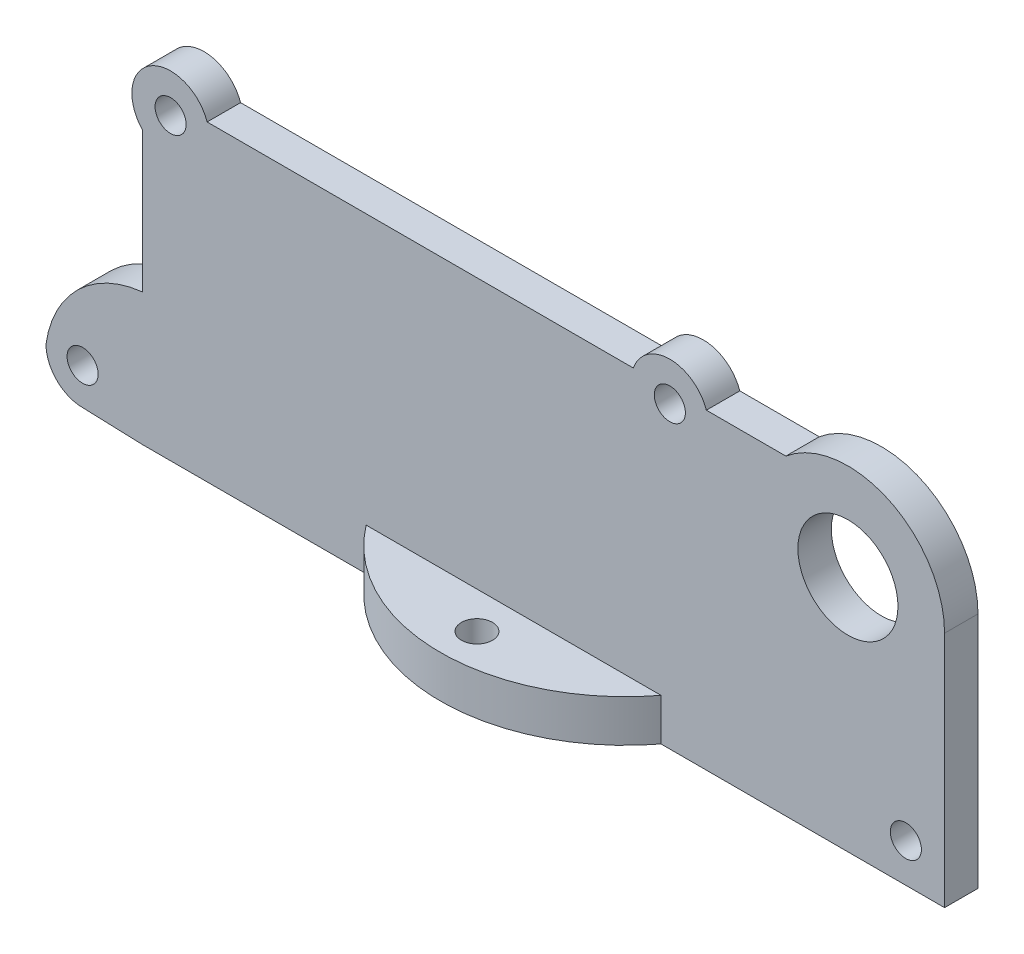
ISO-10303-21;
HEADER;
FILE_DESCRIPTION(('STEP AP214'),'2;1');
FILE_NAME('part.step','',(''),(''),'','','');
FILE_SCHEMA(('AUTOMOTIVE_DESIGN { 1 0 10303 214 1 1 1 1 }'));
ENDSEC;
DATA;
#1=APPLICATION_CONTEXT('core data for automotive mechanical design processes');
#2=APPLICATION_PROTOCOL_DEFINITION('international standard','automotive_design',2000,#1);
#3=PRODUCT_CONTEXT('',#1,'mechanical');
#4=PRODUCT('Part','Part','',(#3));
#5=PRODUCT_RELATED_PRODUCT_CATEGORY('part','',(#4));
#6=PRODUCT_DEFINITION_FORMATION('','',#4);
#7=PRODUCT_DEFINITION_CONTEXT('part definition',#1,'design');
#8=PRODUCT_DEFINITION('design','',#6,#7);
#9=PRODUCT_DEFINITION_SHAPE('','',#8);
#10=(LENGTH_UNIT() NAMED_UNIT(*) SI_UNIT(.MILLI.,.METRE.));
#11=(NAMED_UNIT(*) PLANE_ANGLE_UNIT() SI_UNIT($,.RADIAN.));
#12=(NAMED_UNIT(*) SI_UNIT($,.STERADIAN.) SOLID_ANGLE_UNIT());
#13=UNCERTAINTY_MEASURE_WITH_UNIT(LENGTH_MEASURE(1.E-05),#10,'distance_accuracy_value','');
#14=(GEOMETRIC_REPRESENTATION_CONTEXT(3) GLOBAL_UNCERTAINTY_ASSIGNED_CONTEXT((#13)) GLOBAL_UNIT_ASSIGNED_CONTEXT((#10,
#11,#12)) REPRESENTATION_CONTEXT('',''));
#15=CARTESIAN_POINT('',(0.,0.,0.));
#16=DIRECTION('',(0.,0.,1.));
#17=DIRECTION('',(1.,0.,0.));
#18=AXIS2_PLACEMENT_3D('',#15,#16,#17);
#19=CARTESIAN_POINT('',(0.,14.8,3.175));
#20=DIRECTION('',(0.,1.,0.));
#21=DIRECTION('',(0.,0.,1.));
#22=AXIS2_PLACEMENT_3D('',#19,#20,#21);
#23=PLANE('',#22);
#24=DIRECTION('',(0.,0.,-1.));
#25=VECTOR('',#24,1.);
#26=CARTESIAN_POINT('',(27.1358442652225,14.8,13.5694696834423));
#27=LINE('',#26,#25);
#28=CARTESIAN_POINT('',(27.1358442652225,14.8,3.175));
#29=VERTEX_POINT('',#28);
#30=CARTESIAN_POINT('',(27.1358442652225,14.8,0.));
#31=VERTEX_POINT('',#30);
#32=EDGE_CURVE('E305',#29,#31,#27,.T.);
#33=ORIENTED_EDGE('',*,*,#32,.F.);
#34=DIRECTION('',(1.,0.,0.));
#35=VECTOR('',#34,1.);
#36=CARTESIAN_POINT('',(0.,14.8,3.175));
#37=LINE('',#36,#35);
#38=CARTESIAN_POINT('',(34.6802621326928,14.8,3.175));
#39=VERTEX_POINT('',#38);
#40=EDGE_CURVE('E210',#29,#39,#37,.T.);
#41=ORIENTED_EDGE('',*,*,#40,.T.);
#42=DIRECTION('',(0.,0.,-1.));
#43=VECTOR('',#42,1.);
#44=CARTESIAN_POINT('',(34.6802621326928,14.8,15.1599874843489));
#45=LINE('',#44,#43);
#46=CARTESIAN_POINT('',(34.6802621326928,14.8,0.));
#47=VERTEX_POINT('',#46);
#48=EDGE_CURVE('E360',#39,#47,#45,.T.);
#49=ORIENTED_EDGE('',*,*,#48,.T.);
#50=DIRECTION('',(1.,0.,0.));
#51=VECTOR('',#50,1.);
#52=CARTESIAN_POINT('',(0.,14.8,0.));
#53=LINE('',#52,#51);
#54=EDGE_CURVE('E100',#31,#47,#53,.T.);
#55=ORIENTED_EDGE('',*,*,#54,.F.);
#56=EDGE_LOOP('',(#33,#41,#49,#55));
#57=FACE_BOUND('',#56,.T.);
#58=ADVANCED_FACE('F84',(#57),#23,.T.);
#59=CARTESIAN_POINT('',(-26.416,0.,3.175));
#60=DIRECTION('',(-1.,0.,0.));
#61=DIRECTION('',(0.,0.,1.));
#62=AXIS2_PLACEMENT_3D('',#59,#60,#61);
#63=PLANE('',#62);
#64=DIRECTION('',(0.,1.,0.));
#65=VECTOR('',#64,1.);
#66=CARTESIAN_POINT('',(-26.416,0.,3.175));
#67=LINE('',#66,#65);
#68=CARTESIAN_POINT('',(-26.416,-2.24921211834756,3.175));
#69=VERTEX_POINT('',#68);
#70=CARTESIAN_POINT('',(-26.416,11.0753976457499,3.175));
#71=VERTEX_POINT('',#70);
#72=EDGE_CURVE('E225',#69,#71,#67,.T.);
#73=ORIENTED_EDGE('',*,*,#72,.T.);
#74=DIRECTION('',(0.,0.,-1.));
#75=VECTOR('',#74,1.);
#76=CARTESIAN_POINT('',(-26.416,11.0753976457499,13.5694696834423));
#77=LINE('',#76,#75);
#78=CARTESIAN_POINT('',(-26.416,11.0753976457499,0.));
#79=VERTEX_POINT('',#78);
#80=EDGE_CURVE('E331',#79,#71,#77,.F.);
#81=ORIENTED_EDGE('',*,*,#80,.F.);
#82=DIRECTION('',(0.,1.,0.));
#83=VECTOR('',#82,1.);
#84=CARTESIAN_POINT('',(-26.416,0.,0.));
#85=LINE('',#84,#83);
#86=CARTESIAN_POINT('',(-26.416,-2.24921211834756,0.));
#87=VERTEX_POINT('',#86);
#88=EDGE_CURVE('E219',#87,#79,#85,.T.);
#89=ORIENTED_EDGE('',*,*,#88,.F.);
#90=DIRECTION('',(0.,0.,-1.));
#91=VECTOR('',#90,1.);
#92=CARTESIAN_POINT('',(-26.416,-2.24921211834756,13.5694696834423));
#93=LINE('',#92,#91);
#94=EDGE_CURVE('E93',#69,#87,#93,.T.);
#95=ORIENTED_EDGE('',*,*,#94,.F.);
#96=EDGE_LOOP('',(#73,#81,#89,#95));
#97=FACE_BOUND('',#96,.T.);
#98=ADVANCED_FACE('F397',(#97),#63,.T.);
#99=DIRECTION('',(0.,0.,-1.));
#100=VECTOR('',#99,1.);
#101=CARTESIAN_POINT('',(20.1956641522859,14.8,13.5694696834423));
#102=LINE('',#101,#100);
#103=CARTESIAN_POINT('',(20.1956641522859,14.8,0.));
#104=VERTEX_POINT('',#103);
#105=CARTESIAN_POINT('',(20.1956641522859,14.8,3.175));
#106=VERTEX_POINT('',#105);
#107=EDGE_CURVE('E108',#104,#106,#102,.F.);
#108=ORIENTED_EDGE('',*,*,#107,.F.);
#109=CARTESIAN_POINT('',(-20.2659099435317,14.8,0.));
#110=VERTEX_POINT('',#109);
#111=EDGE_CURVE('E233',#110,#104,#53,.T.);
#112=ORIENTED_EDGE('',*,*,#111,.F.);
#113=DIRECTION('',(0.,0.,-1.));
#114=VECTOR('',#113,1.);
#115=CARTESIAN_POINT('',(-20.2659099435317,14.8,13.5694696834423));
#116=LINE('',#115,#114);
#117=CARTESIAN_POINT('',(-20.2659099435317,14.8,3.175));
#118=VERTEX_POINT('',#117);
#119=EDGE_CURVE('E325',#118,#110,#116,.T.);
#120=ORIENTED_EDGE('',*,*,#119,.F.);
#121=EDGE_CURVE('E216',#118,#106,#37,.T.);
#122=ORIENTED_EDGE('',*,*,#121,.T.);
#123=EDGE_LOOP('',(#108,#112,#120,#122));
#124=FACE_BOUND('',#123,.T.);
#125=ADVANCED_FACE('F372',(#124),#23,.T.);
#126=CARTESIAN_POINT('',(0.,0.,0.));
#127=DIRECTION('',(0.,0.,1.));
#128=DIRECTION('',(1.,0.,0.));
#129=AXIS2_PLACEMENT_3D('',#126,#127,#128);
#130=PLANE('',#129);
#131=CARTESIAN_POINT('',(-23.736,13.59,0.));
#132=DIRECTION('',(0.,0.,-1.));
#133=DIRECTION('',(-1.,0.,0.));
#134=AXIS2_PLACEMENT_3D('',#131,#132,#133);
#135=CIRCLE('',#134,1.475);
#136=CARTESIAN_POINT('',(-25.211,13.59,0.));
#137=VERTEX_POINT('',#136);
#138=EDGE_CURVE('E335',#137,#137,#135,.T.);
#139=ORIENTED_EDGE('',*,*,#138,.F.);
#140=EDGE_LOOP('',(#139));
#141=FACE_BOUND('',#140,.T.);
#142=CARTESIAN_POINT('',(23.6657542087542,13.59,0.));
#143=DIRECTION('',(0.,0.,-1.));
#144=DIRECTION('',(-1.,0.,0.));
#145=AXIS2_PLACEMENT_3D('',#142,#143,#144);
#146=CIRCLE('',#145,1.475);
#147=CARTESIAN_POINT('',(22.1907542087542,13.59,0.));
#148=VERTEX_POINT('',#147);
#149=EDGE_CURVE('E308',#148,#148,#146,.T.);
#150=ORIENTED_EDGE('',*,*,#149,.F.);
#151=EDGE_LOOP('',(#150));
#152=FACE_BOUND('',#151,.T.);
#153=ORIENTED_EDGE('',*,*,#88,.T.);
#154=CARTESIAN_POINT('',(-23.736,13.59,0.));
#155=DIRECTION('',(0.,0.,-1.));
#156=DIRECTION('',(-1.,0.,0.));
#157=AXIS2_PLACEMENT_3D('',#154,#155,#156);
#158=CIRCLE('',#157,3.675);
#159=EDGE_CURVE('E320',#79,#110,#158,.T.);
#160=ORIENTED_EDGE('',*,*,#159,.T.);
#161=ORIENTED_EDGE('',*,*,#111,.T.);
#162=CARTESIAN_POINT('',(23.6657542087542,13.59,0.));
#163=DIRECTION('',(0.,0.,-1.));
#164=DIRECTION('',(-1.,0.,0.));
#165=AXIS2_PLACEMENT_3D('',#162,#163,#164);
#166=CIRCLE('',#165,3.675);
#167=EDGE_CURVE('E297',#104,#31,#166,.T.);
#168=ORIENTED_EDGE('',*,*,#167,.T.);
#169=ORIENTED_EDGE('',*,*,#54,.T.);
#170=CARTESIAN_POINT('',(40.576,7.77,0.));
#171=DIRECTION('',(0.,0.,-1.));
#172=DIRECTION('',(-1.,0.,0.));
#173=AXIS2_PLACEMENT_3D('',#170,#171,#172);
#174=CIRCLE('',#173,9.17500000000001);
#175=CARTESIAN_POINT('',(49.751,7.77,0.));
#176=VERTEX_POINT('',#175);
#177=EDGE_CURVE('E355',#47,#176,#174,.T.);
#178=ORIENTED_EDGE('',*,*,#177,.T.);
#179=DIRECTION('',(0.,-1.,0.));
#180=VECTOR('',#179,1.);
#181=CARTESIAN_POINT('',(49.751,0.,0.));
#182=LINE('',#181,#180);
#183=CARTESIAN_POINT('',(49.751,-14.8,0.));
#184=VERTEX_POINT('',#183);
#185=EDGE_CURVE('E343',#176,#184,#182,.T.);
#186=ORIENTED_EDGE('',*,*,#185,.T.);
#187=DIRECTION('',(-1.,0.,0.));
#188=VECTOR('',#187,1.);
#189=CARTESIAN_POINT('',(0.,-14.8,0.));
#190=LINE('',#189,#188);
#191=CARTESIAN_POINT('',(-26.416,-14.8,0.));
#192=VERTEX_POINT('',#191);
#193=EDGE_CURVE('E229',#184,#192,#190,.T.);
#194=ORIENTED_EDGE('',*,*,#193,.T.);
#195=DIRECTION('',(0.999379568352552,-0.0352204253163911,0.));
#196=VECTOR('',#195,1.);
#197=CARTESIAN_POINT('',(-0.553707363402039,-15.7114464365321,0.));
#198=LINE('',#197,#196);
#199=CARTESIAN_POINT('',(-32.091,-14.6,0.));
#200=VERTEX_POINT('',#199);
#201=EDGE_CURVE('E277',#200,#192,#198,.T.);
#202=ORIENTED_EDGE('',*,*,#201,.F.);
#203=CARTESIAN_POINT('',(-32.091,-11.125,0.));
#204=DIRECTION('',(0.,0.,-1.));
#205=DIRECTION('',(-1.,0.,0.));
#206=AXIS2_PLACEMENT_3D('',#203,#204,#205);
#207=CIRCLE('',#206,3.475);
#208=CARTESIAN_POINT('',(-35.566,-11.1250000000001,0.));
#209=VERTEX_POINT('',#208);
#210=EDGE_CURVE('E264',#200,#209,#207,.T.);
#211=ORIENTED_EDGE('',*,*,#210,.T.);
#212=CARTESIAN_POINT('',(-25.3023929116583,-12.5514592357434,0.));
#213=DIRECTION('',(0.,0.,-1.));
#214=DIRECTION('',(-1.,0.,0.));
#215=AXIS2_PLACEMENT_3D('',#212,#213,#214);
#216=CIRCLE('',#215,10.3622592331545);
#217=EDGE_CURVE('E252',#209,#87,#216,.T.);
#218=ORIENTED_EDGE('',*,*,#217,.T.);
#219=EDGE_LOOP('',(#153,#160,#161,#168,#169,#178,#186,#194,#202,#211,#218));
#220=FACE_BOUND('',#219,.T.);
#221=CARTESIAN_POINT('',(46.076,-11.125,0.));
#222=DIRECTION('',(0.,0.,-1.));
#223=DIRECTION('',(-1.,0.,0.));
#224=AXIS2_PLACEMENT_3D('',#221,#222,#223);
#225=CIRCLE('',#224,1.475);
#226=CARTESIAN_POINT('',(44.601,-11.125,0.));
#227=VERTEX_POINT('',#226);
#228=EDGE_CURVE('E312',#227,#227,#225,.T.);
#229=ORIENTED_EDGE('',*,*,#228,.F.);
#230=EDGE_LOOP('',(#229));
#231=FACE_BOUND('',#230,.T.);
#232=CARTESIAN_POINT('',(40.576,7.77,0.));
#233=DIRECTION('',(0.,0.,-1.));
#234=DIRECTION('',(-1.,0.,0.));
#235=AXIS2_PLACEMENT_3D('',#232,#233,#234);
#236=CIRCLE('',#235,4.75);
#237=CARTESIAN_POINT('',(35.826,7.77,0.));
#238=VERTEX_POINT('',#237);
#239=EDGE_CURVE('E221',#238,#238,#236,.T.);
#240=ORIENTED_EDGE('',*,*,#239,.F.);
#241=EDGE_LOOP('',(#240));
#242=FACE_BOUND('',#241,.T.);
#243=CARTESIAN_POINT('',(-32.091,-11.125,0.));
#244=DIRECTION('',(0.,0.,-1.));
#245=DIRECTION('',(-1.,0.,0.));
#246=AXIS2_PLACEMENT_3D('',#243,#244,#245);
#247=CIRCLE('',#246,1.475);
#248=CARTESIAN_POINT('',(-33.566,-11.125,0.));
#249=VERTEX_POINT('',#248);
#250=EDGE_CURVE('E273',#249,#249,#247,.T.);
#251=ORIENTED_EDGE('',*,*,#250,.F.);
#252=EDGE_LOOP('',(#251));
#253=FACE_BOUND('',#252,.T.);
#254=ADVANCED_FACE('F258',(#141,#152,#220,#231,#242,#253),#130,.F.);
#255=CARTESIAN_POINT('',(0.,0.,3.175));
#256=DIRECTION('',(0.,0.,1.));
#257=DIRECTION('',(1.,0.,0.));
#258=AXIS2_PLACEMENT_3D('',#255,#256,#257);
#259=PLANE('',#258);
#260=CARTESIAN_POINT('',(-23.736,13.59,3.175));
#261=DIRECTION('',(0.,0.,1.));
#262=DIRECTION('',(1.,0.,0.));
#263=AXIS2_PLACEMENT_3D('',#260,#261,#262);
#264=CIRCLE('',#263,1.475);
#265=CARTESIAN_POINT('',(-22.261,13.59,3.175));
#266=VERTEX_POINT('',#265);
#267=EDGE_CURVE('E339',#266,#266,#264,.T.);
#268=ORIENTED_EDGE('',*,*,#267,.F.);
#269=EDGE_LOOP('',(#268));
#270=FACE_BOUND('',#269,.T.);
#271=CARTESIAN_POINT('',(23.6657542087542,13.59,3.175));
#272=DIRECTION('',(0.,0.,1.));
#273=DIRECTION('',(1.,0.,0.));
#274=AXIS2_PLACEMENT_3D('',#271,#272,#273);
#275=CIRCLE('',#274,1.475);
#276=CARTESIAN_POINT('',(25.1407542087542,13.59,3.175));
#277=VERTEX_POINT('',#276);
#278=EDGE_CURVE('E12',#277,#277,#275,.T.);
#279=ORIENTED_EDGE('',*,*,#278,.F.);
#280=EDGE_LOOP('',(#279));
#281=FACE_BOUND('',#280,.T.);
#282=DIRECTION('',(0.,-1.,0.));
#283=VECTOR('',#282,1.);
#284=CARTESIAN_POINT('',(-5.16999999999999,-10.8,3.175));
#285=LINE('',#284,#283);
#286=CARTESIAN_POINT('',(-5.16999999999999,-10.8,3.175));
#287=VERTEX_POINT('',#286);
#288=CARTESIAN_POINT('',(-5.16999999999999,-14.8,3.175));
#289=VERTEX_POINT('',#288);
#290=EDGE_CURVE('E186',#287,#289,#285,.T.);
#291=ORIENTED_EDGE('',*,*,#290,.F.);
#292=DIRECTION('',(-1.,0.,0.));
#293=VECTOR('',#292,1.);
#294=CARTESIAN_POINT('',(0.,-10.8,3.175));
#295=LINE('',#294,#293);
#296=CARTESIAN_POINT('',(22.83,-10.8,3.175));
#297=VERTEX_POINT('',#296);
#298=EDGE_CURVE('E201',#297,#287,#295,.T.);
#299=ORIENTED_EDGE('',*,*,#298,.F.);
#300=DIRECTION('',(0.,-1.,0.));
#301=VECTOR('',#300,1.);
#302=CARTESIAN_POINT('',(22.83,-10.8,3.175));
#303=LINE('',#302,#301);
#304=CARTESIAN_POINT('',(22.83,-14.8,3.175));
#305=VERTEX_POINT('',#304);
#306=EDGE_CURVE('E183',#297,#305,#303,.T.);
#307=ORIENTED_EDGE('',*,*,#306,.T.);
#308=DIRECTION('',(-1.,0.,0.));
#309=VECTOR('',#308,1.);
#310=CARTESIAN_POINT('',(0.,-14.8,3.175));
#311=LINE('',#310,#309);
#312=CARTESIAN_POINT('',(49.751,-14.8,3.175));
#313=VERTEX_POINT('',#312);
#314=EDGE_CURVE('E199',#313,#305,#311,.T.);
#315=ORIENTED_EDGE('',*,*,#314,.F.);
#316=DIRECTION('',(0.,1.,0.));
#317=VECTOR('',#316,1.);
#318=CARTESIAN_POINT('',(49.751,0.,3.175));
#319=LINE('',#318,#317);
#320=CARTESIAN_POINT('',(49.751,7.77,3.175));
#321=VERTEX_POINT('',#320);
#322=EDGE_CURVE('E350',#313,#321,#319,.T.);
#323=ORIENTED_EDGE('',*,*,#322,.T.);
#324=CARTESIAN_POINT('',(40.576,7.77,3.175));
#325=DIRECTION('',(0.,0.,1.));
#326=DIRECTION('',(1.,0.,0.));
#327=AXIS2_PLACEMENT_3D('',#324,#325,#326);
#328=CIRCLE('',#327,9.17500000000001);
#329=EDGE_CURVE('E358',#39,#321,#328,.F.);
#330=ORIENTED_EDGE('',*,*,#329,.F.);
#331=ORIENTED_EDGE('',*,*,#40,.F.);
#332=CARTESIAN_POINT('',(23.6657542087542,13.59,3.175));
#333=DIRECTION('',(0.,0.,1.));
#334=DIRECTION('',(1.,0.,0.));
#335=AXIS2_PLACEMENT_3D('',#332,#333,#334);
#336=CIRCLE('',#335,3.675);
#337=EDGE_CURVE('E290',#106,#29,#336,.F.);
#338=ORIENTED_EDGE('',*,*,#337,.F.);
#339=ORIENTED_EDGE('',*,*,#121,.F.);
#340=CARTESIAN_POINT('',(-23.736,13.59,3.175));
#341=DIRECTION('',(0.,0.,1.));
#342=DIRECTION('',(1.,0.,0.));
#343=AXIS2_PLACEMENT_3D('',#340,#341,#342);
#344=CIRCLE('',#343,3.675);
#345=EDGE_CURVE('E321',#71,#118,#344,.F.);
#346=ORIENTED_EDGE('',*,*,#345,.F.);
#347=ORIENTED_EDGE('',*,*,#72,.F.);
#348=CARTESIAN_POINT('',(-25.3023929116583,-12.5514592357434,3.175));
#349=DIRECTION('',(0.,0.,1.));
#350=DIRECTION('',(1.,0.,0.));
#351=AXIS2_PLACEMENT_3D('',#348,#349,#350);
#352=CIRCLE('',#351,10.3622592331545);
#353=CARTESIAN_POINT('',(-35.566,-11.1250000000001,3.175));
#354=VERTEX_POINT('',#353);
#355=EDGE_CURVE('E254',#354,#69,#352,.F.);
#356=ORIENTED_EDGE('',*,*,#355,.F.);
#357=CARTESIAN_POINT('',(-32.091,-11.125,3.175));
#358=DIRECTION('',(0.,0.,1.));
#359=DIRECTION('',(1.,0.,0.));
#360=AXIS2_PLACEMENT_3D('',#357,#358,#359);
#361=CIRCLE('',#360,3.475);
#362=CARTESIAN_POINT('',(-32.091,-14.6,3.175));
#363=VERTEX_POINT('',#362);
#364=EDGE_CURVE('E282',#363,#354,#361,.F.);
#365=ORIENTED_EDGE('',*,*,#364,.F.);
#366=DIRECTION('',(0.999379568352552,-0.0352204253163911,0.));
#367=VECTOR('',#366,1.);
#368=CARTESIAN_POINT('',(-0.553707363402039,-15.7114464365321,3.175));
#369=LINE('',#368,#367);
#370=CARTESIAN_POINT('',(-26.416,-14.8,3.175));
#371=VERTEX_POINT('',#370);
#372=EDGE_CURVE('E270',#363,#371,#369,.T.);
#373=ORIENTED_EDGE('',*,*,#372,.T.);
#374=EDGE_CURVE('E211',#289,#371,#311,.T.);
#375=ORIENTED_EDGE('',*,*,#374,.F.);
#376=EDGE_LOOP('',(#291,#299,#307,#315,#323,#330,#331,#338,#339,#346,#347,#356,#365,#373,#375));
#377=FACE_BOUND('',#376,.T.);
#378=CARTESIAN_POINT('',(46.076,-11.125,3.175));
#379=DIRECTION('',(0.,0.,1.));
#380=DIRECTION('',(1.,0.,0.));
#381=AXIS2_PLACEMENT_3D('',#378,#379,#380);
#382=CIRCLE('',#381,1.475);
#383=CARTESIAN_POINT('',(47.551,-11.125,3.175));
#384=VERTEX_POINT('',#383);
#385=EDGE_CURVE('E316',#384,#384,#382,.F.);
#386=ORIENTED_EDGE('',*,*,#385,.T.);
#387=EDGE_LOOP('',(#386));
#388=FACE_BOUND('',#387,.T.);
#389=CARTESIAN_POINT('',(40.576,7.77,3.175));
#390=DIRECTION('',(0.,0.,1.));
#391=DIRECTION('',(1.,0.,0.));
#392=AXIS2_PLACEMENT_3D('',#389,#390,#391);
#393=CIRCLE('',#392,4.75);
#394=CARTESIAN_POINT('',(45.326,7.77,3.175));
#395=VERTEX_POINT('',#394);
#396=EDGE_CURVE('E232',#395,#395,#393,.T.);
#397=ORIENTED_EDGE('',*,*,#396,.F.);
#398=EDGE_LOOP('',(#397));
#399=FACE_BOUND('',#398,.T.);
#400=CARTESIAN_POINT('',(-32.091,-11.125,3.175));
#401=DIRECTION('',(0.,0.,1.));
#402=DIRECTION('',(1.,0.,0.));
#403=AXIS2_PLACEMENT_3D('',#400,#401,#402);
#404=CIRCLE('',#403,1.475);
#405=CARTESIAN_POINT('',(-33.566,-11.125,3.175));
#406=VERTEX_POINT('',#405);
#407=EDGE_CURVE('E266',#406,#406,#404,.F.);
#408=ORIENTED_EDGE('',*,*,#407,.T.);
#409=EDGE_LOOP('',(#408));
#410=FACE_BOUND('',#409,.T.);
#411=ADVANCED_FACE('F196',(#270,#281,#377,#388,#399,#410),#259,.T.);
#412=CARTESIAN_POINT('',(0.,-14.8,3.175));
#413=DIRECTION('',(0.,-1.,0.));
#414=DIRECTION('',(1.,0.,0.));
#415=AXIS2_PLACEMENT_3D('',#412,#413,#414);
#416=PLANE('',#415);
#417=ORIENTED_EDGE('',*,*,#314,.T.);
#418=CARTESIAN_POINT('',(8.83000000000001,-14.8,-7.45071942446047));
#419=DIRECTION('',(0.,1.,0.));
#420=DIRECTION('',(-1.,0.,0.));
#421=AXIS2_PLACEMENT_3D('',#418,#419,#420);
#422=CIRCLE('',#421,17.5757194244605);
#423=EDGE_CURVE('E180',#289,#305,#422,.T.);
#424=ORIENTED_EDGE('',*,*,#423,.F.);
#425=ORIENTED_EDGE('',*,*,#374,.T.);
#426=DIRECTION('',(0.,0.,-1.));
#427=VECTOR('',#426,1.);
#428=CARTESIAN_POINT('',(-26.416,-14.8,3.175));
#429=LINE('',#428,#427);
#430=EDGE_CURVE('E228',#371,#192,#429,.T.);
#431=ORIENTED_EDGE('',*,*,#430,.T.);
#432=ORIENTED_EDGE('',*,*,#193,.F.);
#433=DIRECTION('',(0.,0.,-1.));
#434=VECTOR('',#433,1.);
#435=CARTESIAN_POINT('',(49.751,-14.8,10.));
#436=LINE('',#435,#434);
#437=EDGE_CURVE('E208',#313,#184,#436,.T.);
#438=ORIENTED_EDGE('',*,*,#437,.F.);
#439=EDGE_LOOP('',(#417,#424,#425,#431,#432,#438));
#440=FACE_BOUND('',#439,.T.);
#441=CARTESIAN_POINT('',(8.83000000000001,-14.8,6.65));
#442=DIRECTION('',(0.,-1.,0.));
#443=DIRECTION('',(1.,0.,0.));
#444=AXIS2_PLACEMENT_3D('',#441,#442,#443);
#445=CIRCLE('',#444,1.475);
#446=CARTESIAN_POINT('',(10.305,-14.8,6.65));
#447=VERTEX_POINT('',#446);
#448=EDGE_CURVE('E779',#447,#447,#445,.T.);
#449=ORIENTED_EDGE('',*,*,#448,.F.);
#450=EDGE_LOOP('',(#449));
#451=FACE_BOUND('',#450,.T.);
#452=ADVANCED_FACE('F86',(#440,#451),#416,.T.);
#453=CARTESIAN_POINT('',(40.576,7.77,10.));
#454=DIRECTION('',(0.,0.,-1.));
#455=DIRECTION('',(-1.,0.,0.));
#456=AXIS2_PLACEMENT_3D('',#453,#454,#455);
#457=CYLINDRICAL_SURFACE('',#456,4.75);
#458=ORIENTED_EDGE('',*,*,#396,.T.);
#459=EDGE_LOOP('',(#458));
#460=FACE_BOUND('',#459,.T.);
#461=ORIENTED_EDGE('',*,*,#239,.T.);
#462=EDGE_LOOP('',(#461));
#463=FACE_BOUND('',#462,.T.);
#464=ADVANCED_FACE('F368',(#460,#463),#457,.F.);
#465=CARTESIAN_POINT('',(40.576,7.77,15.1599874843489));
#466=DIRECTION('',(0.,0.,-1.));
#467=DIRECTION('',(-1.,0.,0.));
#468=AXIS2_PLACEMENT_3D('',#465,#466,#467);
#469=CYLINDRICAL_SURFACE('',#468,9.17500000000001);
#470=ORIENTED_EDGE('',*,*,#48,.F.);
#471=ORIENTED_EDGE('',*,*,#329,.T.);
#472=DIRECTION('',(0.,0.,-1.));
#473=VECTOR('',#472,1.);
#474=CARTESIAN_POINT('',(49.751,7.77,10.));
#475=LINE('',#474,#473);
#476=EDGE_CURVE('E347',#321,#176,#475,.T.);
#477=ORIENTED_EDGE('',*,*,#476,.T.);
#478=ORIENTED_EDGE('',*,*,#177,.F.);
#479=EDGE_LOOP('',(#470,#471,#477,#478));
#480=FACE_BOUND('',#479,.T.);
#481=ADVANCED_FACE('F429',(#480),#469,.T.);
#482=CARTESIAN_POINT('',(49.751,0.,10.));
#483=DIRECTION('',(1.,0.,0.));
#484=DIRECTION('',(0.,0.,-1.));
#485=AXIS2_PLACEMENT_3D('',#482,#483,#484);
#486=PLANE('',#485);
#487=ORIENTED_EDGE('',*,*,#437,.T.);
#488=ORIENTED_EDGE('',*,*,#185,.F.);
#489=ORIENTED_EDGE('',*,*,#476,.F.);
#490=ORIENTED_EDGE('',*,*,#322,.F.);
#491=EDGE_LOOP('',(#487,#488,#489,#490));
#492=FACE_BOUND('',#491,.T.);
#493=ADVANCED_FACE('F437',(#492),#486,.T.);
#494=CARTESIAN_POINT('',(-23.736,13.59,10.));
#495=DIRECTION('',(0.,0.,-1.));
#496=DIRECTION('',(-1.,0.,0.));
#497=AXIS2_PLACEMENT_3D('',#494,#495,#496);
#498=CYLINDRICAL_SURFACE('',#497,1.475);
#499=ORIENTED_EDGE('',*,*,#138,.T.);
#500=EDGE_LOOP('',(#499));
#501=FACE_BOUND('',#500,.T.);
#502=ORIENTED_EDGE('',*,*,#267,.T.);
#503=EDGE_LOOP('',(#502));
#504=FACE_BOUND('',#503,.T.);
#505=ADVANCED_FACE('F446',(#501,#504),#498,.F.);
#506=CARTESIAN_POINT('',(-23.736,13.59,13.5694696834423));
#507=DIRECTION('',(0.,0.,-1.));
#508=DIRECTION('',(-1.,0.,0.));
#509=AXIS2_PLACEMENT_3D('',#506,#507,#508);
#510=CYLINDRICAL_SURFACE('',#509,3.675);
#511=ORIENTED_EDGE('',*,*,#159,.F.);
#512=ORIENTED_EDGE('',*,*,#80,.T.);
#513=ORIENTED_EDGE('',*,*,#345,.T.);
#514=ORIENTED_EDGE('',*,*,#119,.T.);
#515=EDGE_LOOP('',(#511,#512,#513,#514));
#516=FACE_BOUND('',#515,.T.);
#517=ADVANCED_FACE('F455',(#516),#510,.T.);
#518=CARTESIAN_POINT('',(46.076,-11.125,7.34693000900062));
#519=DIRECTION('',(0.,0.,-1.));
#520=DIRECTION('',(-1.,0.,0.));
#521=AXIS2_PLACEMENT_3D('',#518,#519,#520);
#522=CYLINDRICAL_SURFACE('',#521,1.475);
#523=ORIENTED_EDGE('',*,*,#228,.T.);
#524=EDGE_LOOP('',(#523));
#525=FACE_BOUND('',#524,.T.);
#526=ORIENTED_EDGE('',*,*,#385,.F.);
#527=EDGE_LOOP('',(#526));
#528=FACE_BOUND('',#527,.T.);
#529=ADVANCED_FACE('F463',(#525,#528),#522,.F.);
#530=CARTESIAN_POINT('',(23.6657542087542,13.59,10.));
#531=DIRECTION('',(0.,0.,-1.));
#532=DIRECTION('',(-1.,0.,0.));
#533=AXIS2_PLACEMENT_3D('',#530,#531,#532);
#534=CYLINDRICAL_SURFACE('',#533,1.475);
#535=ORIENTED_EDGE('',*,*,#149,.T.);
#536=EDGE_LOOP('',(#535));
#537=FACE_BOUND('',#536,.T.);
#538=ORIENTED_EDGE('',*,*,#278,.T.);
#539=EDGE_LOOP('',(#538));
#540=FACE_BOUND('',#539,.T.);
#541=ADVANCED_FACE('F472',(#537,#540),#534,.F.);
#542=CARTESIAN_POINT('',(23.6657542087542,13.59,13.5694696834423));
#543=DIRECTION('',(0.,0.,-1.));
#544=DIRECTION('',(-1.,0.,0.));
#545=AXIS2_PLACEMENT_3D('',#542,#543,#544);
#546=CYLINDRICAL_SURFACE('',#545,3.675);
#547=ORIENTED_EDGE('',*,*,#337,.T.);
#548=ORIENTED_EDGE('',*,*,#32,.T.);
#549=ORIENTED_EDGE('',*,*,#167,.F.);
#550=ORIENTED_EDGE('',*,*,#107,.T.);
#551=EDGE_LOOP('',(#547,#548,#549,#550));
#552=FACE_BOUND('',#551,.T.);
#553=ADVANCED_FACE('F481',(#552),#546,.T.);
#554=CARTESIAN_POINT('',(-0.553707363402039,-15.7114464365321,18.7070564140822));
#555=DIRECTION('',(0.0352204253163911,0.999379568352552,0.));
#556=DIRECTION('',(-0.999379568352552,0.0352204253163911,0.));
#557=AXIS2_PLACEMENT_3D('',#554,#555,#556);
#558=PLANE('',#557);
#559=ORIENTED_EDGE('',*,*,#372,.F.);
#560=DIRECTION('',(0.,0.,-1.));
#561=VECTOR('',#560,1.);
#562=CARTESIAN_POINT('',(-32.091,-14.6,18.7070564140822));
#563=LINE('',#562,#561);
#564=EDGE_CURVE('E280',#363,#200,#563,.T.);
#565=ORIENTED_EDGE('',*,*,#564,.T.);
#566=ORIENTED_EDGE('',*,*,#201,.T.);
#567=ORIENTED_EDGE('',*,*,#430,.F.);
#568=EDGE_LOOP('',(#559,#565,#566,#567));
#569=FACE_BOUND('',#568,.T.);
#570=ADVANCED_FACE('F490',(#569),#558,.F.);
#571=CARTESIAN_POINT('',(-25.3023929116583,-12.5514592357434,18.7070564140822));
#572=DIRECTION('',(0.,0.,-1.));
#573=DIRECTION('',(-1.,0.,0.));
#574=AXIS2_PLACEMENT_3D('',#571,#572,#573);
#575=CYLINDRICAL_SURFACE('',#574,10.3622592331545);
#576=DIRECTION('',(0.,0.,-1.));
#577=VECTOR('',#576,1.);
#578=CARTESIAN_POINT('',(-35.566,-11.1250000000001,18.7070564140822));
#579=LINE('',#578,#577);
#580=EDGE_CURVE('E286',#354,#209,#579,.T.);
#581=ORIENTED_EDGE('',*,*,#580,.F.);
#582=ORIENTED_EDGE('',*,*,#355,.T.);
#583=ORIENTED_EDGE('',*,*,#94,.T.);
#584=ORIENTED_EDGE('',*,*,#217,.F.);
#585=EDGE_LOOP('',(#581,#582,#583,#584));
#586=FACE_BOUND('',#585,.T.);
#587=ADVANCED_FACE('F251',(#586),#575,.T.);
#588=CARTESIAN_POINT('',(-32.091,-11.125,18.7070564140822));
#589=DIRECTION('',(0.,0.,-1.));
#590=DIRECTION('',(-1.,0.,0.));
#591=AXIS2_PLACEMENT_3D('',#588,#589,#590);
#592=CYLINDRICAL_SURFACE('',#591,3.475);
#593=ORIENTED_EDGE('',*,*,#564,.F.);
#594=ORIENTED_EDGE('',*,*,#364,.T.);
#595=ORIENTED_EDGE('',*,*,#580,.T.);
#596=ORIENTED_EDGE('',*,*,#210,.F.);
#597=EDGE_LOOP('',(#593,#594,#595,#596));
#598=FACE_BOUND('',#597,.T.);
#599=ADVANCED_FACE('F383',(#598),#592,.T.);
#600=CARTESIAN_POINT('',(-32.091,-11.125,18.7070564140822));
#601=DIRECTION('',(0.,0.,-1.));
#602=DIRECTION('',(-1.,0.,0.));
#603=AXIS2_PLACEMENT_3D('',#600,#601,#602);
#604=CYLINDRICAL_SURFACE('',#603,1.475);
#605=CARTESIAN_POINT('',(-33.566,-11.125,0.));
#606=CARTESIAN_POINT('',(-33.566,-11.125,0.0330729166666671));
#607=CARTESIAN_POINT('',(-33.566,-11.125,0.0661458333333342));
#608=CARTESIAN_POINT('',(-33.566,-11.125,0.132291666666667));
#609=CARTESIAN_POINT('',(-33.566,-11.125,0.165364583333333));
#610=CARTESIAN_POINT('',(-33.566,-11.125,0.231510416666666));
#611=CARTESIAN_POINT('',(-33.566,-11.125,0.264583333333333));
#612=CARTESIAN_POINT('',(-33.566,-11.125,0.330729166666667));
#613=CARTESIAN_POINT('',(-33.566,-11.125,0.363802083333334));
#614=CARTESIAN_POINT('',(-33.566,-11.125,0.429947916666667));
#615=CARTESIAN_POINT('',(-33.566,-11.125,0.463020833333333));
#616=CARTESIAN_POINT('',(-33.566,-11.125,0.529166666666666));
#617=CARTESIAN_POINT('',(-33.566,-11.125,0.562239583333333));
#618=CARTESIAN_POINT('',(-33.566,-11.125,0.628385416666667));
#619=CARTESIAN_POINT('',(-33.566,-11.125,0.661458333333334));
#620=CARTESIAN_POINT('',(-33.566,-11.125,0.727604166666667));
#621=CARTESIAN_POINT('',(-33.566,-11.125,0.760677083333333));
#622=CARTESIAN_POINT('',(-33.566,-11.125,0.826822916666666));
#623=CARTESIAN_POINT('',(-33.566,-11.125,0.859895833333334));
#624=CARTESIAN_POINT('',(-33.566,-11.125,0.926041666666668));
#625=CARTESIAN_POINT('',(-33.566,-11.125,0.959114583333335));
#626=CARTESIAN_POINT('',(-33.566,-11.125,1.02526041666667));
#627=CARTESIAN_POINT('',(-33.566,-11.125,1.05833333333333));
#628=CARTESIAN_POINT('',(-33.566,-11.125,1.12447916666667));
#629=CARTESIAN_POINT('',(-33.566,-11.125,1.15755208333333));
#630=CARTESIAN_POINT('',(-33.566,-11.125,1.22369791666667));
#631=CARTESIAN_POINT('',(-33.566,-11.125,1.25677083333333));
#632=CARTESIAN_POINT('',(-33.566,-11.125,1.32291666666667));
#633=CARTESIAN_POINT('',(-33.566,-11.125,1.35598958333333));
#634=CARTESIAN_POINT('',(-33.566,-11.125,1.42213541666667));
#635=CARTESIAN_POINT('',(-33.566,-11.125,1.45520833333333));
#636=CARTESIAN_POINT('',(-33.566,-11.125,1.52135416666667));
#637=CARTESIAN_POINT('',(-33.566,-11.125,1.55442708333333));
#638=CARTESIAN_POINT('',(-33.566,-11.125,1.62057291666667));
#639=CARTESIAN_POINT('',(-33.566,-11.125,1.65364583333333));
#640=CARTESIAN_POINT('',(-33.566,-11.125,1.71979166666667));
#641=CARTESIAN_POINT('',(-33.566,-11.125,1.75286458333333));
#642=CARTESIAN_POINT('',(-33.566,-11.125,1.81901041666667));
#643=CARTESIAN_POINT('',(-33.566,-11.125,1.85208333333333));
#644=CARTESIAN_POINT('',(-33.566,-11.125,1.91822916666667));
#645=CARTESIAN_POINT('',(-33.566,-11.125,1.95130208333333));
#646=CARTESIAN_POINT('',(-33.566,-11.125,2.01744791666667));
#647=CARTESIAN_POINT('',(-33.566,-11.125,2.05052083333333));
#648=CARTESIAN_POINT('',(-33.566,-11.125,2.11666666666667));
#649=CARTESIAN_POINT('',(-33.566,-11.125,2.14973958333333));
#650=CARTESIAN_POINT('',(-33.566,-11.125,2.21588541666667));
#651=CARTESIAN_POINT('',(-33.566,-11.125,2.24895833333333));
#652=CARTESIAN_POINT('',(-33.566,-11.125,2.31510416666667));
#653=CARTESIAN_POINT('',(-33.566,-11.125,2.34817708333333));
#654=CARTESIAN_POINT('',(-33.566,-11.125,2.41432291666667));
#655=CARTESIAN_POINT('',(-33.566,-11.125,2.44739583333333));
#656=CARTESIAN_POINT('',(-33.566,-11.125,2.51354166666667));
#657=CARTESIAN_POINT('',(-33.566,-11.125,2.54661458333333));
#658=CARTESIAN_POINT('',(-33.566,-11.125,2.61276041666667));
#659=CARTESIAN_POINT('',(-33.566,-11.125,2.64583333333333));
#660=CARTESIAN_POINT('',(-33.566,-11.125,2.71197916666667));
#661=CARTESIAN_POINT('',(-33.566,-11.125,2.74505208333333));
#662=CARTESIAN_POINT('',(-33.566,-11.125,2.81119791666667));
#663=CARTESIAN_POINT('',(-33.566,-11.125,2.84427083333333));
#664=CARTESIAN_POINT('',(-33.566,-11.125,2.91041666666667));
#665=CARTESIAN_POINT('',(-33.566,-11.125,2.94348958333333));
#666=CARTESIAN_POINT('',(-33.566,-11.125,3.00963541666667));
#667=CARTESIAN_POINT('',(-33.566,-11.125,3.04270833333333));
#668=CARTESIAN_POINT('',(-33.566,-11.125,3.10885416666667));
#669=CARTESIAN_POINT('',(-33.566,-11.125,3.14192708333333));
#670=CARTESIAN_POINT('',(-33.566,-11.125,3.175));
#671=B_SPLINE_CURVE_WITH_KNOTS('',3,(#605,#606,#607,#608,#609,#610,#611,#612,#613,#614,#615,
#616,#617,#618,#619,#620,#621,#622,#623,#624,#625,#626,#627,#628,#629,#630,#631,#632,#633,#634,
#635,#636,#637,#638,#639,#640,#641,#642,#643,#644,#645,#646,#647,#648,#649,#650,#651,#652,#653,
#654,#655,#656,#657,#658,#659,#660,#661,#662,#663,#664,#665,#666,#667,#668,#669,#670),
.UNSPECIFIED.,.F.,.F.,(4,2,2,2,2,2,2,2,2,2,2,2,2,2,2,2,2,2,2,2,2,2,2,2,2,2,2,2,2,2,2,2,4),(0.,
0.0992187500000012,0.198437499999999,0.29765625,0.396875000000001,0.496093749999999,0.5953125,
0.694531250000002,0.793749999999999,0.892968750000001,0.992187500000002,1.09140625,1.190625,
1.28984375,1.3890625,1.48828125,1.5875,1.68671875,1.7859375,1.88515625,1.984375,2.08359375,
2.1828125,2.28203125,2.38125,2.48046875,2.5796875,2.67890625,2.778125,2.87734375,2.9765625,
3.07578125,3.175),.UNSPECIFIED.);
#672=EDGE_CURVE('BSEAM379',#249,#406,#671,.T.);
#673=ORIENTED_EDGE('',*,*,#250,.T.);
#674=ORIENTED_EDGE('',*,*,#407,.F.);
#675=ORIENTED_EDGE('',*,*,#672,.T.);
#676=ORIENTED_EDGE('',*,*,#672,.F.);
#677=EDGE_LOOP('',(#673,#675,#674,#676));
#678=FACE_BOUND('',#677,.T.);
#679=ADVANCED_FACE('F379',(#678),#604,.F.);
#680=CARTESIAN_POINT('',(8.83000000000001,-10.8,6.65));
#681=DIRECTION('',(0.,-1.,0.));
#682=DIRECTION('',(1.,0.,0.));
#683=AXIS2_PLACEMENT_3D('',#680,#681,#682);
#684=CYLINDRICAL_SURFACE('',#683,1.475);
#685=CARTESIAN_POINT('',(8.83000000000001,-10.8,6.65));
#686=DIRECTION('',(0.,-1.,0.));
#687=DIRECTION('',(1.,0.,0.));
#688=AXIS2_PLACEMENT_3D('',#685,#686,#687);
#689=CIRCLE('',#688,1.475);
#690=CARTESIAN_POINT('',(10.305,-10.8,6.65));
#691=VERTEX_POINT('',#690);
#692=EDGE_CURVE('E203',#691,#691,#689,.T.);
#693=ORIENTED_EDGE('',*,*,#692,.F.);
#694=EDGE_LOOP('',(#693));
#695=FACE_BOUND('',#694,.T.);
#696=ORIENTED_EDGE('',*,*,#448,.T.);
#697=EDGE_LOOP('',(#696));
#698=FACE_BOUND('',#697,.T.);
#699=ADVANCED_FACE('F382',(#695,#698),#684,.F.);
#700=CARTESIAN_POINT('',(0.,-10.8,0.));
#701=DIRECTION('',(0.,-1.,0.));
#702=DIRECTION('',(1.,0.,0.));
#703=AXIS2_PLACEMENT_3D('',#700,#701,#702);
#704=PLANE('',#703);
#705=ORIENTED_EDGE('',*,*,#298,.T.);
#706=CARTESIAN_POINT('',(8.83000000000001,-10.8,-7.45071942446047));
#707=DIRECTION('',(0.,-1.,0.));
#708=DIRECTION('',(1.,0.,0.));
#709=AXIS2_PLACEMENT_3D('',#706,#707,#708);
#710=CIRCLE('',#709,17.5757194244605);
#711=EDGE_CURVE('E191',#297,#287,#710,.T.);
#712=ORIENTED_EDGE('',*,*,#711,.F.);
#713=EDGE_LOOP('',(#705,#712));
#714=FACE_BOUND('',#713,.T.);
#715=ORIENTED_EDGE('',*,*,#692,.T.);
#716=EDGE_LOOP('',(#715));
#717=FACE_BOUND('',#716,.T.);
#718=ADVANCED_FACE('F527',(#714,#717),#704,.F.);
#719=CARTESIAN_POINT('',(8.83,18.0496533774671,-7.45071942446047));
#720=DIRECTION('',(0.,-1.,0.));
#721=DIRECTION('',(1.,0.,0.));
#722=AXIS2_PLACEMENT_3D('',#719,#720,#721);
#723=CYLINDRICAL_SURFACE('',#722,17.5757194244605);
#724=ORIENTED_EDGE('',*,*,#711,.T.);
#725=ORIENTED_EDGE('',*,*,#290,.T.);
#726=ORIENTED_EDGE('',*,*,#423,.T.);
#727=ORIENTED_EDGE('',*,*,#306,.F.);
#728=EDGE_LOOP('',(#724,#725,#726,#727));
#729=FACE_BOUND('',#728,.T.);
#730=ADVANCED_FACE('F182',(#729),#723,.T.);
#731=CLOSED_SHELL('',(#58,#98,#125,#254,#411,#452,#464,#481,#493,#505,#517,#529,#541,#553,#570,
#587,#599,#679,#699,#718,#730));
#732=MANIFOLD_SOLID_BREP('B2',#731);
#733=ADVANCED_BREP_SHAPE_REPRESENTATION('',(#18,#732),#14);
#734=SHAPE_DEFINITION_REPRESENTATION(#9,#733);
ENDSEC;
END-ISO-10303-21;
